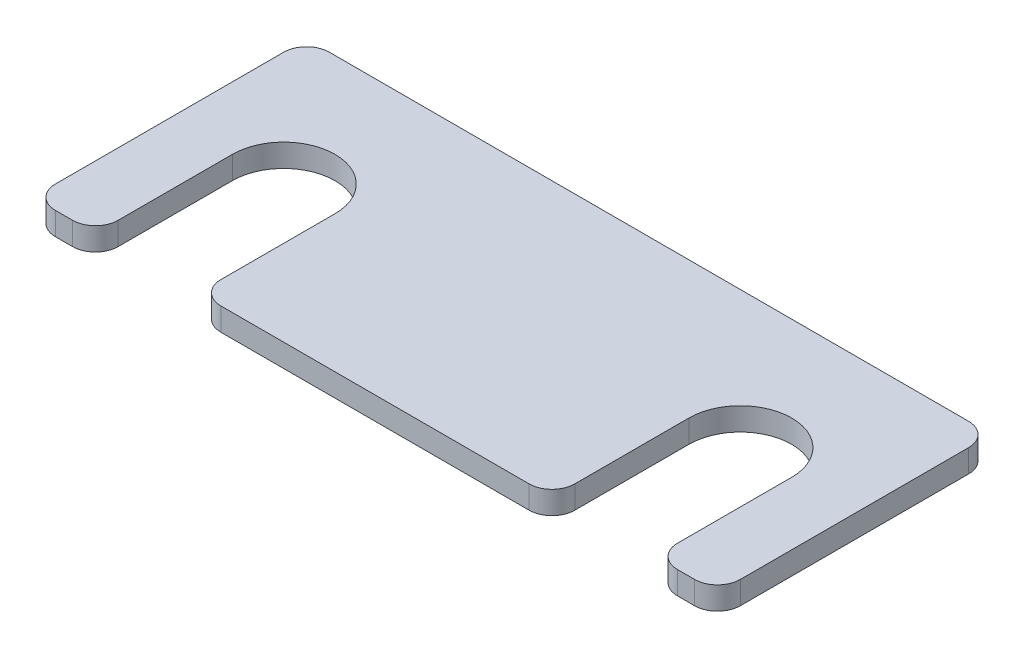
ISO-10303-21;
HEADER;
FILE_DESCRIPTION(('STEP AP214'),'2;1');
FILE_NAME('part.step','',(''),(''),'','','');
FILE_SCHEMA(('AUTOMOTIVE_DESIGN { 1 0 10303 214 1 1 1 1 }'));
ENDSEC;
DATA;
#1=APPLICATION_CONTEXT('core data for automotive mechanical design processes');
#2=APPLICATION_PROTOCOL_DEFINITION('international standard','automotive_design',2000,#1);
#3=PRODUCT_CONTEXT('',#1,'mechanical');
#4=PRODUCT('Part','Part','',(#3));
#5=PRODUCT_RELATED_PRODUCT_CATEGORY('part','',(#4));
#6=PRODUCT_DEFINITION_FORMATION('','',#4);
#7=PRODUCT_DEFINITION_CONTEXT('part definition',#1,'design');
#8=PRODUCT_DEFINITION('design','',#6,#7);
#9=PRODUCT_DEFINITION_SHAPE('','',#8);
#10=(LENGTH_UNIT() NAMED_UNIT(*) SI_UNIT(.MILLI.,.METRE.));
#11=(NAMED_UNIT(*) PLANE_ANGLE_UNIT() SI_UNIT($,.RADIAN.));
#12=(NAMED_UNIT(*) SI_UNIT($,.STERADIAN.) SOLID_ANGLE_UNIT());
#13=UNCERTAINTY_MEASURE_WITH_UNIT(LENGTH_MEASURE(1.E-05),#10,'distance_accuracy_value','');
#14=(GEOMETRIC_REPRESENTATION_CONTEXT(3) GLOBAL_UNCERTAINTY_ASSIGNED_CONTEXT((#13)) GLOBAL_UNIT_ASSIGNED_CONTEXT((#10,
#11,#12)) REPRESENTATION_CONTEXT('',''));
#15=CARTESIAN_POINT('',(0.,0.,0.));
#16=DIRECTION('',(0.,0.,1.));
#17=DIRECTION('',(1.,0.,0.));
#18=AXIS2_PLACEMENT_3D('',#15,#16,#17);
#19=CARTESIAN_POINT('',(14.,-1.,5.));
#20=DIRECTION('',(0.,1.,0.));
#21=DIRECTION('',(0.,0.,1.));
#22=AXIS2_PLACEMENT_3D('',#19,#20,#21);
#23=CYLINDRICAL_SURFACE('',#22,1.);
#24=CARTESIAN_POINT('',(14.,0.,5.));
#25=DIRECTION('',(0.,1.,0.));
#26=DIRECTION('',(0.,0.,-1.));
#27=AXIS2_PLACEMENT_3D('',#24,#25,#26);
#28=CIRCLE('',#27,1.);
#29=CARTESIAN_POINT('',(14.,0.,6.));
#30=VERTEX_POINT('',#29);
#31=CARTESIAN_POINT('',(15.,0.,5.));
#32=VERTEX_POINT('',#31);
#33=EDGE_CURVE('E42',#30,#32,#28,.T.);
#34=ORIENTED_EDGE('',*,*,#33,.F.);
#35=DIRECTION('',(0.,1.,0.));
#36=VECTOR('',#35,1.);
#37=CARTESIAN_POINT('',(14.,-1.,6.));
#38=LINE('',#37,#36);
#39=CARTESIAN_POINT('',(14.,-1.,6.));
#40=VERTEX_POINT('',#39);
#41=EDGE_CURVE('E116',#40,#30,#38,.T.);
#42=ORIENTED_EDGE('',*,*,#41,.F.);
#43=CARTESIAN_POINT('',(14.,-1.,5.));
#44=DIRECTION('',(0.,1.,0.));
#45=DIRECTION('',(0.,0.,-1.));
#46=AXIS2_PLACEMENT_3D('',#43,#44,#45);
#47=CIRCLE('',#46,1.);
#48=CARTESIAN_POINT('',(15.,-1.,5.));
#49=VERTEX_POINT('',#48);
#50=EDGE_CURVE('E11',#40,#49,#47,.T.);
#51=ORIENTED_EDGE('',*,*,#50,.T.);
#52=DIRECTION('',(0.,1.,0.));
#53=VECTOR('',#52,1.);
#54=CARTESIAN_POINT('',(15.,-1.,5.));
#55=LINE('',#54,#53);
#56=EDGE_CURVE('E27',#49,#32,#55,.T.);
#57=ORIENTED_EDGE('',*,*,#56,.T.);
#58=EDGE_LOOP('',(#34,#42,#51,#57));
#59=FACE_BOUND('',#58,.T.);
#60=ADVANCED_FACE('F16',(#59),#23,.T.);
#61=CARTESIAN_POINT('',(13.25,-1.,6.));
#62=DIRECTION('',(0.,0.,1.));
#63=DIRECTION('',(1.,0.,0.));
#64=AXIS2_PLACEMENT_3D('',#61,#62,#63);
#65=PLANE('',#64);
#66=DIRECTION('',(1.,0.,0.));
#67=VECTOR('',#66,1.);
#68=CARTESIAN_POINT('',(13.25,0.,6.));
#69=LINE('',#68,#67);
#70=CARTESIAN_POINT('',(13.25,0.,6.));
#71=VERTEX_POINT('',#70);
#72=EDGE_CURVE('E338',#71,#30,#69,.T.);
#73=ORIENTED_EDGE('',*,*,#72,.F.);
#74=DIRECTION('',(0.,1.,0.));
#75=VECTOR('',#74,1.);
#76=CARTESIAN_POINT('',(13.25,-1.,6.));
#77=LINE('',#76,#75);
#78=CARTESIAN_POINT('',(13.25,-1.,6.));
#79=VERTEX_POINT('',#78);
#80=EDGE_CURVE('E288',#79,#71,#77,.T.);
#81=ORIENTED_EDGE('',*,*,#80,.F.);
#82=DIRECTION('',(1.,0.,0.));
#83=VECTOR('',#82,1.);
#84=CARTESIAN_POINT('',(13.25,-1.,6.));
#85=LINE('',#84,#83);
#86=EDGE_CURVE('E113',#79,#40,#85,.T.);
#87=ORIENTED_EDGE('',*,*,#86,.T.);
#88=ORIENTED_EDGE('',*,*,#41,.T.);
#89=EDGE_LOOP('',(#73,#81,#87,#88));
#90=FACE_BOUND('',#89,.T.);
#91=ADVANCED_FACE('F18',(#90),#65,.T.);
#92=CARTESIAN_POINT('',(13.25,-1.,5.));
#93=DIRECTION('',(0.,1.,0.));
#94=DIRECTION('',(0.,0.,1.));
#95=AXIS2_PLACEMENT_3D('',#92,#93,#94);
#96=CYLINDRICAL_SURFACE('',#95,1.);
#97=CARTESIAN_POINT('',(13.25,0.,5.));
#98=DIRECTION('',(0.,1.,0.));
#99=DIRECTION('',(0.,0.,1.));
#100=AXIS2_PLACEMENT_3D('',#97,#98,#99);
#101=CIRCLE('',#100,1.);
#102=CARTESIAN_POINT('',(12.25,0.,5.));
#103=VERTEX_POINT('',#102);
#104=EDGE_CURVE('E299',#103,#71,#101,.T.);
#105=ORIENTED_EDGE('',*,*,#104,.F.);
#106=DIRECTION('',(0.,1.,0.));
#107=VECTOR('',#106,1.);
#108=CARTESIAN_POINT('',(12.25,-1.,5.));
#109=LINE('',#108,#107);
#110=CARTESIAN_POINT('',(12.25,-1.,5.));
#111=VERTEX_POINT('',#110);
#112=EDGE_CURVE('E252',#111,#103,#109,.T.);
#113=ORIENTED_EDGE('',*,*,#112,.F.);
#114=CARTESIAN_POINT('',(13.25,-1.,5.));
#115=DIRECTION('',(0.,1.,0.));
#116=DIRECTION('',(0.,0.,1.));
#117=AXIS2_PLACEMENT_3D('',#114,#115,#116);
#118=CIRCLE('',#117,1.);
#119=EDGE_CURVE('E184',#111,#79,#118,.T.);
#120=ORIENTED_EDGE('',*,*,#119,.T.);
#121=ORIENTED_EDGE('',*,*,#80,.T.);
#122=EDGE_LOOP('',(#105,#113,#120,#121));
#123=FACE_BOUND('',#122,.T.);
#124=ADVANCED_FACE('F482',(#123),#96,.T.);
#125=CARTESIAN_POINT('',(12.25,-1.,0.));
#126=DIRECTION('',(-1.,0.,0.));
#127=DIRECTION('',(0.,0.,1.));
#128=AXIS2_PLACEMENT_3D('',#125,#126,#127);
#129=PLANE('',#128);
#130=DIRECTION('',(0.,0.,1.));
#131=VECTOR('',#130,1.);
#132=CARTESIAN_POINT('',(12.25,0.,0.));
#133=LINE('',#132,#131);
#134=CARTESIAN_POINT('',(12.25,0.,0.));
#135=VERTEX_POINT('',#134);
#136=EDGE_CURVE('E196',#135,#103,#133,.T.);
#137=ORIENTED_EDGE('',*,*,#136,.F.);
#138=DIRECTION('',(0.,1.,0.));
#139=VECTOR('',#138,1.);
#140=CARTESIAN_POINT('',(12.25,-1.,0.));
#141=LINE('',#140,#139);
#142=CARTESIAN_POINT('',(12.25,-1.,0.));
#143=VERTEX_POINT('',#142);
#144=EDGE_CURVE('E201',#143,#135,#141,.T.);
#145=ORIENTED_EDGE('',*,*,#144,.F.);
#146=DIRECTION('',(0.,0.,1.));
#147=VECTOR('',#146,1.);
#148=CARTESIAN_POINT('',(12.25,-1.,0.));
#149=LINE('',#148,#147);
#150=EDGE_CURVE('E256',#143,#111,#149,.T.);
#151=ORIENTED_EDGE('',*,*,#150,.T.);
#152=ORIENTED_EDGE('',*,*,#112,.T.);
#153=EDGE_LOOP('',(#137,#145,#151,#152));
#154=FACE_BOUND('',#153,.T.);
#155=ADVANCED_FACE('F501',(#154),#129,.T.);
#156=CARTESIAN_POINT('',(10.,-1.,0.));
#157=DIRECTION('',(0.,1.,0.));
#158=DIRECTION('',(0.,0.,1.));
#159=AXIS2_PLACEMENT_3D('',#156,#157,#158);
#160=CYLINDRICAL_SURFACE('',#159,2.25);
#161=CARTESIAN_POINT('',(10.,0.,0.));
#162=DIRECTION('',(0.,-1.,0.));
#163=DIRECTION('',(0.,0.,1.));
#164=AXIS2_PLACEMENT_3D('',#161,#162,#163);
#165=CIRCLE('',#164,2.25);
#166=CARTESIAN_POINT('',(7.75,0.,0.));
#167=VERTEX_POINT('',#166);
#168=EDGE_CURVE('E191',#167,#135,#165,.T.);
#169=ORIENTED_EDGE('',*,*,#168,.F.);
#170=DIRECTION('',(0.,1.,0.));
#171=VECTOR('',#170,1.);
#172=CARTESIAN_POINT('',(7.75,-1.,0.));
#173=LINE('',#172,#171);
#174=CARTESIAN_POINT('',(7.75,-1.,0.));
#175=VERTEX_POINT('',#174);
#176=EDGE_CURVE('E202',#175,#167,#173,.T.);
#177=ORIENTED_EDGE('',*,*,#176,.F.);
#178=CARTESIAN_POINT('',(10.,-1.,0.));
#179=DIRECTION('',(0.,-1.,0.));
#180=DIRECTION('',(0.,0.,1.));
#181=AXIS2_PLACEMENT_3D('',#178,#179,#180);
#182=CIRCLE('',#181,2.25);
#183=EDGE_CURVE('E257',#175,#143,#182,.T.);
#184=ORIENTED_EDGE('',*,*,#183,.T.);
#185=ORIENTED_EDGE('',*,*,#144,.T.);
#186=EDGE_LOOP('',(#169,#177,#184,#185));
#187=FACE_BOUND('',#186,.T.);
#188=ADVANCED_FACE('F485',(#187),#160,.F.);
#189=CARTESIAN_POINT('',(7.75,-1.,0.));
#190=DIRECTION('',(1.,0.,0.));
#191=DIRECTION('',(0.,1.,0.));
#192=AXIS2_PLACEMENT_3D('',#189,#190,#191);
#193=PLANE('',#192);
#194=DIRECTION('',(0.,0.,-1.));
#195=VECTOR('',#194,1.);
#196=CARTESIAN_POINT('',(7.75,0.,0.));
#197=LINE('',#196,#195);
#198=CARTESIAN_POINT('',(7.75,0.,5.));
#199=VERTEX_POINT('',#198);
#200=EDGE_CURVE('E195',#199,#167,#197,.T.);
#201=ORIENTED_EDGE('',*,*,#200,.F.);
#202=DIRECTION('',(0.,1.,0.));
#203=VECTOR('',#202,1.);
#204=CARTESIAN_POINT('',(7.75,-1.,5.));
#205=LINE('',#204,#203);
#206=CARTESIAN_POINT('',(7.75,-1.,5.));
#207=VERTEX_POINT('',#206);
#208=EDGE_CURVE('E188',#207,#199,#205,.T.);
#209=ORIENTED_EDGE('',*,*,#208,.F.);
#210=DIRECTION('',(0.,0.,-1.));
#211=VECTOR('',#210,1.);
#212=CARTESIAN_POINT('',(7.75,-1.,0.));
#213=LINE('',#212,#211);
#214=EDGE_CURVE('E197',#207,#175,#213,.T.);
#215=ORIENTED_EDGE('',*,*,#214,.T.);
#216=ORIENTED_EDGE('',*,*,#176,.T.);
#217=EDGE_LOOP('',(#201,#209,#215,#216));
#218=FACE_BOUND('',#217,.T.);
#219=ADVANCED_FACE('F489',(#218),#193,.T.);
#220=CARTESIAN_POINT('',(6.75,-1.,5.));
#221=DIRECTION('',(0.,1.,0.));
#222=DIRECTION('',(0.,0.,1.));
#223=AXIS2_PLACEMENT_3D('',#220,#221,#222);
#224=CYLINDRICAL_SURFACE('',#223,1.);
#225=CARTESIAN_POINT('',(6.75,0.,5.));
#226=DIRECTION('',(0.,1.,0.));
#227=DIRECTION('',(0.,0.,-1.));
#228=AXIS2_PLACEMENT_3D('',#225,#226,#227);
#229=CIRCLE('',#228,1.);
#230=CARTESIAN_POINT('',(6.75,0.,6.));
#231=VERTEX_POINT('',#230);
#232=EDGE_CURVE('E239',#231,#199,#229,.T.);
#233=ORIENTED_EDGE('',*,*,#232,.F.);
#234=DIRECTION('',(0.,1.,0.));
#235=VECTOR('',#234,1.);
#236=CARTESIAN_POINT('',(6.75,-1.,6.));
#237=LINE('',#236,#235);
#238=CARTESIAN_POINT('',(6.75,-1.,6.));
#239=VERTEX_POINT('',#238);
#240=EDGE_CURVE('E189',#239,#231,#237,.T.);
#241=ORIENTED_EDGE('',*,*,#240,.F.);
#242=CARTESIAN_POINT('',(6.75,-1.,5.));
#243=DIRECTION('',(0.,1.,0.));
#244=DIRECTION('',(0.,0.,-1.));
#245=AXIS2_PLACEMENT_3D('',#242,#243,#244);
#246=CIRCLE('',#245,1.);
#247=EDGE_CURVE('E284',#239,#207,#246,.T.);
#248=ORIENTED_EDGE('',*,*,#247,.T.);
#249=ORIENTED_EDGE('',*,*,#208,.T.);
#250=EDGE_LOOP('',(#233,#241,#248,#249));
#251=FACE_BOUND('',#250,.T.);
#252=ADVANCED_FACE('F491',(#251),#224,.T.);
#253=CARTESIAN_POINT('',(-6.75,-1.,6.));
#254=DIRECTION('',(0.,0.,1.));
#255=DIRECTION('',(1.,0.,0.));
#256=AXIS2_PLACEMENT_3D('',#253,#254,#255);
#257=PLANE('',#256);
#258=DIRECTION('',(1.,0.,0.));
#259=VECTOR('',#258,1.);
#260=CARTESIAN_POINT('',(-6.75,0.,6.));
#261=LINE('',#260,#259);
#262=CARTESIAN_POINT('',(-6.75,0.,6.));
#263=VERTEX_POINT('',#262);
#264=EDGE_CURVE('E138',#263,#231,#261,.T.);
#265=ORIENTED_EDGE('',*,*,#264,.F.);
#266=DIRECTION('',(0.,1.,0.));
#267=VECTOR('',#266,1.);
#268=CARTESIAN_POINT('',(-6.75,-1.,6.));
#269=LINE('',#268,#267);
#270=CARTESIAN_POINT('',(-6.75,-1.,6.));
#271=VERTEX_POINT('',#270);
#272=EDGE_CURVE('E154',#271,#263,#269,.T.);
#273=ORIENTED_EDGE('',*,*,#272,.F.);
#274=DIRECTION('',(1.,0.,0.));
#275=VECTOR('',#274,1.);
#276=CARTESIAN_POINT('',(-6.75,-1.,6.));
#277=LINE('',#276,#275);
#278=EDGE_CURVE('E185',#271,#239,#277,.T.);
#279=ORIENTED_EDGE('',*,*,#278,.T.);
#280=ORIENTED_EDGE('',*,*,#240,.T.);
#281=EDGE_LOOP('',(#265,#273,#279,#280));
#282=FACE_BOUND('',#281,.T.);
#283=ADVANCED_FACE('F512',(#282),#257,.T.);
#284=CARTESIAN_POINT('',(-6.75,-1.,5.));
#285=DIRECTION('',(0.,1.,0.));
#286=DIRECTION('',(0.,0.,1.));
#287=AXIS2_PLACEMENT_3D('',#284,#285,#286);
#288=CYLINDRICAL_SURFACE('',#287,1.);
#289=CARTESIAN_POINT('',(-6.75,0.,5.));
#290=DIRECTION('',(0.,1.,0.));
#291=DIRECTION('',(0.,0.,1.));
#292=AXIS2_PLACEMENT_3D('',#289,#290,#291);
#293=CIRCLE('',#292,1.);
#294=CARTESIAN_POINT('',(-7.75,0.,5.));
#295=VERTEX_POINT('',#294);
#296=EDGE_CURVE('E295',#295,#263,#293,.T.);
#297=ORIENTED_EDGE('',*,*,#296,.F.);
#298=DIRECTION('',(0.,1.,0.));
#299=VECTOR('',#298,1.);
#300=CARTESIAN_POINT('',(-7.75,-1.,5.));
#301=LINE('',#300,#299);
#302=CARTESIAN_POINT('',(-7.75,-1.,5.));
#303=VERTEX_POINT('',#302);
#304=EDGE_CURVE('E140',#303,#295,#301,.T.);
#305=ORIENTED_EDGE('',*,*,#304,.F.);
#306=CARTESIAN_POINT('',(-6.75,-1.,5.));
#307=DIRECTION('',(0.,1.,0.));
#308=DIRECTION('',(0.,0.,1.));
#309=AXIS2_PLACEMENT_3D('',#306,#307,#308);
#310=CIRCLE('',#309,1.);
#311=EDGE_CURVE('E267',#303,#271,#310,.T.);
#312=ORIENTED_EDGE('',*,*,#311,.T.);
#313=ORIENTED_EDGE('',*,*,#272,.T.);
#314=EDGE_LOOP('',(#297,#305,#312,#313));
#315=FACE_BOUND('',#314,.T.);
#316=ADVANCED_FACE('F516',(#315),#288,.T.);
#317=CARTESIAN_POINT('',(-7.75,-1.,0.));
#318=DIRECTION('',(-1.,0.,0.));
#319=DIRECTION('',(0.,0.,1.));
#320=AXIS2_PLACEMENT_3D('',#317,#318,#319);
#321=PLANE('',#320);
#322=DIRECTION('',(0.,0.,1.));
#323=VECTOR('',#322,1.);
#324=CARTESIAN_POINT('',(-7.75,0.,0.));
#325=LINE('',#324,#323);
#326=CARTESIAN_POINT('',(-7.75,0.,0.));
#327=VERTEX_POINT('',#326);
#328=EDGE_CURVE('E292',#327,#295,#325,.T.);
#329=ORIENTED_EDGE('',*,*,#328,.F.);
#330=DIRECTION('',(0.,1.,0.));
#331=VECTOR('',#330,1.);
#332=CARTESIAN_POINT('',(-7.75,-1.,0.));
#333=LINE('',#332,#331);
#334=CARTESIAN_POINT('',(-7.75,-1.,0.));
#335=VERTEX_POINT('',#334);
#336=EDGE_CURVE('E157',#335,#327,#333,.T.);
#337=ORIENTED_EDGE('',*,*,#336,.F.);
#338=DIRECTION('',(0.,0.,1.));
#339=VECTOR('',#338,1.);
#340=CARTESIAN_POINT('',(-7.75,-1.,0.));
#341=LINE('',#340,#339);
#342=EDGE_CURVE('E143',#335,#303,#341,.T.);
#343=ORIENTED_EDGE('',*,*,#342,.T.);
#344=ORIENTED_EDGE('',*,*,#304,.T.);
#345=EDGE_LOOP('',(#329,#337,#343,#344));
#346=FACE_BOUND('',#345,.T.);
#347=ADVANCED_FACE('F509',(#346),#321,.T.);
#348=CARTESIAN_POINT('',(-10.,-1.,0.));
#349=DIRECTION('',(0.,1.,0.));
#350=DIRECTION('',(0.,0.,1.));
#351=AXIS2_PLACEMENT_3D('',#348,#349,#350);
#352=CYLINDRICAL_SURFACE('',#351,2.25);
#353=CARTESIAN_POINT('',(-10.,0.,0.));
#354=DIRECTION('',(0.,-1.,0.));
#355=DIRECTION('',(0.,0.,1.));
#356=AXIS2_PLACEMENT_3D('',#353,#354,#355);
#357=CIRCLE('',#356,2.25);
#358=CARTESIAN_POINT('',(-12.25,0.,0.));
#359=VERTEX_POINT('',#358);
#360=EDGE_CURVE('E245',#359,#327,#357,.T.);
#361=ORIENTED_EDGE('',*,*,#360,.F.);
#362=DIRECTION('',(0.,1.,0.));
#363=VECTOR('',#362,1.);
#364=CARTESIAN_POINT('',(-12.25,-1.,0.));
#365=LINE('',#364,#363);
#366=CARTESIAN_POINT('',(-12.25,-1.,0.));
#367=VERTEX_POINT('',#366);
#368=EDGE_CURVE('E173',#367,#359,#365,.T.);
#369=ORIENTED_EDGE('',*,*,#368,.F.);
#370=CARTESIAN_POINT('',(-10.,-1.,0.));
#371=DIRECTION('',(0.,-1.,0.));
#372=DIRECTION('',(0.,0.,1.));
#373=AXIS2_PLACEMENT_3D('',#370,#371,#372);
#374=CIRCLE('',#373,2.25);
#375=EDGE_CURVE('E20',#367,#335,#374,.T.);
#376=ORIENTED_EDGE('',*,*,#375,.T.);
#377=ORIENTED_EDGE('',*,*,#336,.T.);
#378=EDGE_LOOP('',(#361,#369,#376,#377));
#379=FACE_BOUND('',#378,.T.);
#380=ADVANCED_FACE('F488',(#379),#352,.F.);
#381=CARTESIAN_POINT('',(-12.25,-1.,0.));
#382=DIRECTION('',(1.,0.,0.));
#383=DIRECTION('',(0.,1.,0.));
#384=AXIS2_PLACEMENT_3D('',#381,#382,#383);
#385=PLANE('',#384);
#386=DIRECTION('',(0.,0.,-1.));
#387=VECTOR('',#386,1.);
#388=CARTESIAN_POINT('',(-12.25,0.,0.));
#389=LINE('',#388,#387);
#390=CARTESIAN_POINT('',(-12.25,0.,5.));
#391=VERTEX_POINT('',#390);
#392=EDGE_CURVE('E240',#391,#359,#389,.T.);
#393=ORIENTED_EDGE('',*,*,#392,.F.);
#394=DIRECTION('',(0.,1.,0.));
#395=VECTOR('',#394,1.);
#396=CARTESIAN_POINT('',(-12.25,-1.,5.));
#397=LINE('',#396,#395);
#398=CARTESIAN_POINT('',(-12.25,-1.,5.));
#399=VERTEX_POINT('',#398);
#400=EDGE_CURVE('E181',#399,#391,#397,.T.);
#401=ORIENTED_EDGE('',*,*,#400,.F.);
#402=DIRECTION('',(0.,0.,-1.));
#403=VECTOR('',#402,1.);
#404=CARTESIAN_POINT('',(-12.25,-1.,0.));
#405=LINE('',#404,#403);
#406=EDGE_CURVE('E165',#399,#367,#405,.T.);
#407=ORIENTED_EDGE('',*,*,#406,.T.);
#408=ORIENTED_EDGE('',*,*,#368,.T.);
#409=EDGE_LOOP('',(#393,#401,#407,#408));
#410=FACE_BOUND('',#409,.T.);
#411=ADVANCED_FACE('F473',(#410),#385,.T.);
#412=CARTESIAN_POINT('',(-13.25,-1.,5.));
#413=DIRECTION('',(0.,1.,0.));
#414=DIRECTION('',(0.,0.,1.));
#415=AXIS2_PLACEMENT_3D('',#412,#413,#414);
#416=CYLINDRICAL_SURFACE('',#415,1.);
#417=CARTESIAN_POINT('',(-13.25,0.,5.));
#418=DIRECTION('',(0.,1.,0.));
#419=DIRECTION('',(0.,0.,-1.));
#420=AXIS2_PLACEMENT_3D('',#417,#418,#419);
#421=CIRCLE('',#420,1.);
#422=CARTESIAN_POINT('',(-13.25,0.,6.));
#423=VERTEX_POINT('',#422);
#424=EDGE_CURVE('E244',#423,#391,#421,.T.);
#425=ORIENTED_EDGE('',*,*,#424,.F.);
#426=DIRECTION('',(0.,1.,0.));
#427=VECTOR('',#426,1.);
#428=CARTESIAN_POINT('',(-13.25,-1.,6.));
#429=LINE('',#428,#427);
#430=CARTESIAN_POINT('',(-13.25,-1.,6.));
#431=VERTEX_POINT('',#430);
#432=EDGE_CURVE('E275',#431,#423,#429,.T.);
#433=ORIENTED_EDGE('',*,*,#432,.F.);
#434=CARTESIAN_POINT('',(-13.25,-1.,5.));
#435=DIRECTION('',(0.,1.,0.));
#436=DIRECTION('',(0.,0.,-1.));
#437=AXIS2_PLACEMENT_3D('',#434,#435,#436);
#438=CIRCLE('',#437,1.);
#439=EDGE_CURVE('E177',#431,#399,#438,.T.);
#440=ORIENTED_EDGE('',*,*,#439,.T.);
#441=ORIENTED_EDGE('',*,*,#400,.T.);
#442=EDGE_LOOP('',(#425,#433,#440,#441));
#443=FACE_BOUND('',#442,.T.);
#444=ADVANCED_FACE('F462',(#443),#416,.T.);
#445=CARTESIAN_POINT('',(-14.,-1.,6.));
#446=DIRECTION('',(0.,0.,1.));
#447=DIRECTION('',(1.,0.,0.));
#448=AXIS2_PLACEMENT_3D('',#445,#446,#447);
#449=PLANE('',#448);
#450=DIRECTION('',(1.,0.,0.));
#451=VECTOR('',#450,1.);
#452=CARTESIAN_POINT('',(-14.,0.,6.));
#453=LINE('',#452,#451);
#454=CARTESIAN_POINT('',(-14.,0.,6.));
#455=VERTEX_POINT('',#454);
#456=EDGE_CURVE('E274',#455,#423,#453,.T.);
#457=ORIENTED_EDGE('',*,*,#456,.F.);
#458=DIRECTION('',(0.,1.,0.));
#459=VECTOR('',#458,1.);
#460=CARTESIAN_POINT('',(-14.,-1.,6.));
#461=LINE('',#460,#459);
#462=CARTESIAN_POINT('',(-14.,-1.,6.));
#463=VERTEX_POINT('',#462);
#464=EDGE_CURVE('E231',#463,#455,#461,.T.);
#465=ORIENTED_EDGE('',*,*,#464,.F.);
#466=DIRECTION('',(1.,0.,0.));
#467=VECTOR('',#466,1.);
#468=CARTESIAN_POINT('',(-14.,-1.,6.));
#469=LINE('',#468,#467);
#470=EDGE_CURVE('E279',#463,#431,#469,.T.);
#471=ORIENTED_EDGE('',*,*,#470,.T.);
#472=ORIENTED_EDGE('',*,*,#432,.T.);
#473=EDGE_LOOP('',(#457,#465,#471,#472));
#474=FACE_BOUND('',#473,.T.);
#475=ADVANCED_FACE('F464',(#474),#449,.T.);
#476=CARTESIAN_POINT('',(-14.,-1.,5.));
#477=DIRECTION('',(0.,1.,0.));
#478=DIRECTION('',(0.,0.,1.));
#479=AXIS2_PLACEMENT_3D('',#476,#477,#478);
#480=CYLINDRICAL_SURFACE('',#479,1.);
#481=CARTESIAN_POINT('',(-14.,0.,5.));
#482=DIRECTION('',(0.,1.,0.));
#483=DIRECTION('',(0.,0.,1.));
#484=AXIS2_PLACEMENT_3D('',#481,#482,#483);
#485=CIRCLE('',#484,1.);
#486=CARTESIAN_POINT('',(-15.,0.,5.));
#487=VERTEX_POINT('',#486);
#488=EDGE_CURVE('E208',#487,#455,#485,.T.);
#489=ORIENTED_EDGE('',*,*,#488,.F.);
#490=DIRECTION('',(0.,1.,0.));
#491=VECTOR('',#490,1.);
#492=CARTESIAN_POINT('',(-15.,-1.,5.));
#493=LINE('',#492,#491);
#494=CARTESIAN_POINT('',(-15.,-1.,5.));
#495=VERTEX_POINT('',#494);
#496=EDGE_CURVE('E250',#495,#487,#493,.T.);
#497=ORIENTED_EDGE('',*,*,#496,.F.);
#498=CARTESIAN_POINT('',(-14.,-1.,5.));
#499=DIRECTION('',(0.,1.,0.));
#500=DIRECTION('',(0.,0.,1.));
#501=AXIS2_PLACEMENT_3D('',#498,#499,#500);
#502=CIRCLE('',#501,1.);
#503=EDGE_CURVE('E280',#495,#463,#502,.T.);
#504=ORIENTED_EDGE('',*,*,#503,.T.);
#505=ORIENTED_EDGE('',*,*,#464,.T.);
#506=EDGE_LOOP('',(#489,#497,#504,#505));
#507=FACE_BOUND('',#506,.T.);
#508=ADVANCED_FACE('F394',(#507),#480,.T.);
#509=CARTESIAN_POINT('',(-15.,-1.,-5.));
#510=DIRECTION('',(-1.,0.,0.));
#511=DIRECTION('',(0.,1.,0.));
#512=AXIS2_PLACEMENT_3D('',#509,#510,#511);
#513=PLANE('',#512);
#514=DIRECTION('',(0.,0.,1.));
#515=VECTOR('',#514,1.);
#516=CARTESIAN_POINT('',(-15.,0.,-5.));
#517=LINE('',#516,#515);
#518=CARTESIAN_POINT('',(-15.,0.,-5.));
#519=VERTEX_POINT('',#518);
#520=EDGE_CURVE('E203',#519,#487,#517,.T.);
#521=ORIENTED_EDGE('',*,*,#520,.F.);
#522=DIRECTION('',(0.,1.,0.));
#523=VECTOR('',#522,1.);
#524=CARTESIAN_POINT('',(-15.,-1.,-5.));
#525=LINE('',#524,#523);
#526=CARTESIAN_POINT('',(-15.,-1.,-5.));
#527=VERTEX_POINT('',#526);
#528=EDGE_CURVE('E251',#527,#519,#525,.T.);
#529=ORIENTED_EDGE('',*,*,#528,.F.);
#530=DIRECTION('',(0.,0.,1.));
#531=VECTOR('',#530,1.);
#532=CARTESIAN_POINT('',(-15.,-1.,-5.));
#533=LINE('',#532,#531);
#534=EDGE_CURVE('E258',#527,#495,#533,.T.);
#535=ORIENTED_EDGE('',*,*,#534,.T.);
#536=ORIENTED_EDGE('',*,*,#496,.T.);
#537=EDGE_LOOP('',(#521,#529,#535,#536));
#538=FACE_BOUND('',#537,.T.);
#539=ADVANCED_FACE('F382',(#538),#513,.T.);
#540=CARTESIAN_POINT('',(-14.,-1.,-5.));
#541=DIRECTION('',(0.,1.,0.));
#542=DIRECTION('',(0.,0.,1.));
#543=AXIS2_PLACEMENT_3D('',#540,#541,#542);
#544=CYLINDRICAL_SURFACE('',#543,1.);
#545=CARTESIAN_POINT('',(-14.,0.,-5.));
#546=DIRECTION('',(0.,1.,0.));
#547=DIRECTION('',(0.,0.,-1.));
#548=AXIS2_PLACEMENT_3D('',#545,#546,#547);
#549=CIRCLE('',#548,1.);
#550=CARTESIAN_POINT('',(-14.,0.,-6.));
#551=VERTEX_POINT('',#550);
#552=EDGE_CURVE('E207',#551,#519,#549,.T.);
#553=ORIENTED_EDGE('',*,*,#552,.F.);
#554=DIRECTION('',(0.,1.,0.));
#555=VECTOR('',#554,1.);
#556=CARTESIAN_POINT('',(-14.,-1.,-6.));
#557=LINE('',#556,#555);
#558=CARTESIAN_POINT('',(-14.,-1.,-6.));
#559=VERTEX_POINT('',#558);
#560=EDGE_CURVE('E210',#559,#551,#557,.T.);
#561=ORIENTED_EDGE('',*,*,#560,.F.);
#562=CARTESIAN_POINT('',(-14.,-1.,-5.));
#563=DIRECTION('',(0.,1.,0.));
#564=DIRECTION('',(0.,0.,-1.));
#565=AXIS2_PLACEMENT_3D('',#562,#563,#564);
#566=CIRCLE('',#565,1.);
#567=EDGE_CURVE('E246',#559,#527,#566,.T.);
#568=ORIENTED_EDGE('',*,*,#567,.T.);
#569=ORIENTED_EDGE('',*,*,#528,.T.);
#570=EDGE_LOOP('',(#553,#561,#568,#569));
#571=FACE_BOUND('',#570,.T.);
#572=ADVANCED_FACE('F378',(#571),#544,.T.);
#573=CARTESIAN_POINT('',(-14.,-1.,-6.));
#574=DIRECTION('',(0.,0.,-1.));
#575=DIRECTION('',(0.,-1.,0.));
#576=AXIS2_PLACEMENT_3D('',#573,#574,#575);
#577=PLANE('',#576);
#578=DIRECTION('',(-1.,0.,0.));
#579=VECTOR('',#578,1.);
#580=CARTESIAN_POINT('',(-14.,0.,-6.));
#581=LINE('',#580,#579);
#582=CARTESIAN_POINT('',(14.,0.,-6.));
#583=VERTEX_POINT('',#582);
#584=EDGE_CURVE('E221',#583,#551,#581,.T.);
#585=ORIENTED_EDGE('',*,*,#584,.F.);
#586=DIRECTION('',(0.,1.,0.));
#587=VECTOR('',#586,1.);
#588=CARTESIAN_POINT('',(14.,-1.,-6.));
#589=LINE('',#588,#587);
#590=CARTESIAN_POINT('',(14.,-1.,-6.));
#591=VERTEX_POINT('',#590);
#592=EDGE_CURVE('E126',#591,#583,#589,.T.);
#593=ORIENTED_EDGE('',*,*,#592,.F.);
#594=DIRECTION('',(-1.,0.,0.));
#595=VECTOR('',#594,1.);
#596=CARTESIAN_POINT('',(-14.,-1.,-6.));
#597=LINE('',#596,#595);
#598=EDGE_CURVE('E306',#591,#559,#597,.T.);
#599=ORIENTED_EDGE('',*,*,#598,.T.);
#600=ORIENTED_EDGE('',*,*,#560,.T.);
#601=EDGE_LOOP('',(#585,#593,#599,#600));
#602=FACE_BOUND('',#601,.T.);
#603=ADVANCED_FACE('F369',(#602),#577,.T.);
#604=CARTESIAN_POINT('',(14.,-1.,-5.));
#605=DIRECTION('',(0.,1.,0.));
#606=DIRECTION('',(0.,0.,1.));
#607=AXIS2_PLACEMENT_3D('',#604,#605,#606);
#608=CYLINDRICAL_SURFACE('',#607,1.);
#609=CARTESIAN_POINT('',(14.,0.,-5.));
#610=DIRECTION('',(0.,1.,0.));
#611=DIRECTION('',(0.,0.,1.));
#612=AXIS2_PLACEMENT_3D('',#609,#610,#611);
#613=CIRCLE('',#612,1.);
#614=CARTESIAN_POINT('',(15.,0.,-5.));
#615=VERTEX_POINT('',#614);
#616=EDGE_CURVE('E212',#615,#583,#613,.T.);
#617=ORIENTED_EDGE('',*,*,#616,.F.);
#618=DIRECTION('',(0.,1.,0.));
#619=VECTOR('',#618,1.);
#620=CARTESIAN_POINT('',(15.,-1.,-5.));
#621=LINE('',#620,#619);
#622=CARTESIAN_POINT('',(15.,-1.,-5.));
#623=VERTEX_POINT('',#622);
#624=EDGE_CURVE('E127',#623,#615,#621,.T.);
#625=ORIENTED_EDGE('',*,*,#624,.F.);
#626=CARTESIAN_POINT('',(14.,-1.,-5.));
#627=DIRECTION('',(0.,1.,0.));
#628=DIRECTION('',(0.,0.,1.));
#629=AXIS2_PLACEMENT_3D('',#626,#627,#628);
#630=CIRCLE('',#629,1.);
#631=EDGE_CURVE('E124',#623,#591,#630,.T.);
#632=ORIENTED_EDGE('',*,*,#631,.T.);
#633=ORIENTED_EDGE('',*,*,#592,.T.);
#634=EDGE_LOOP('',(#617,#625,#632,#633));
#635=FACE_BOUND('',#634,.T.);
#636=ADVANCED_FACE('F495',(#635),#608,.T.);
#637=CARTESIAN_POINT('',(15.,-1.,-5.));
#638=DIRECTION('',(1.,0.,0.));
#639=DIRECTION('',(0.,0.,-1.));
#640=AXIS2_PLACEMENT_3D('',#637,#638,#639);
#641=PLANE('',#640);
#642=DIRECTION('',(0.,0.,-1.));
#643=VECTOR('',#642,1.);
#644=CARTESIAN_POINT('',(15.,0.,-5.));
#645=LINE('',#644,#643);
#646=EDGE_CURVE('E111',#32,#615,#645,.T.);
#647=ORIENTED_EDGE('',*,*,#646,.F.);
#648=ORIENTED_EDGE('',*,*,#56,.F.);
#649=DIRECTION('',(0.,0.,-1.));
#650=VECTOR('',#649,1.);
#651=CARTESIAN_POINT('',(15.,-1.,-5.));
#652=LINE('',#651,#650);
#653=EDGE_CURVE('E109',#49,#623,#652,.T.);
#654=ORIENTED_EDGE('',*,*,#653,.T.);
#655=ORIENTED_EDGE('',*,*,#624,.T.);
#656=EDGE_LOOP('',(#647,#648,#654,#655));
#657=FACE_BOUND('',#656,.T.);
#658=ADVANCED_FACE('F105',(#657),#641,.T.);
#659=CARTESIAN_POINT('',(14.,-1.,5.));
#660=DIRECTION('',(0.,-1.,0.));
#661=DIRECTION('',(0.,0.,-1.));
#662=AXIS2_PLACEMENT_3D('',#659,#660,#661);
#663=PLANE('',#662);
#664=ORIENTED_EDGE('',*,*,#50,.F.);
#665=ORIENTED_EDGE('',*,*,#86,.F.);
#666=ORIENTED_EDGE('',*,*,#119,.F.);
#667=ORIENTED_EDGE('',*,*,#150,.F.);
#668=ORIENTED_EDGE('',*,*,#183,.F.);
#669=ORIENTED_EDGE('',*,*,#214,.F.);
#670=ORIENTED_EDGE('',*,*,#247,.F.);
#671=ORIENTED_EDGE('',*,*,#278,.F.);
#672=ORIENTED_EDGE('',*,*,#311,.F.);
#673=ORIENTED_EDGE('',*,*,#342,.F.);
#674=ORIENTED_EDGE('',*,*,#375,.F.);
#675=ORIENTED_EDGE('',*,*,#406,.F.);
#676=ORIENTED_EDGE('',*,*,#439,.F.);
#677=ORIENTED_EDGE('',*,*,#470,.F.);
#678=ORIENTED_EDGE('',*,*,#503,.F.);
#679=ORIENTED_EDGE('',*,*,#534,.F.);
#680=ORIENTED_EDGE('',*,*,#567,.F.);
#681=ORIENTED_EDGE('',*,*,#598,.F.);
#682=ORIENTED_EDGE('',*,*,#631,.F.);
#683=ORIENTED_EDGE('',*,*,#653,.F.);
#684=EDGE_LOOP('',(#664,#665,#666,#667,#668,#669,#670,#671,#672,#673,#674,#675,#676,#677,#678,
#679,#680,#681,#682,#683));
#685=FACE_BOUND('',#684,.T.);
#686=ADVANCED_FACE('F121',(#685),#663,.T.);
#687=CARTESIAN_POINT('',(14.,0.,5.));
#688=DIRECTION('',(0.,-1.,0.));
#689=DIRECTION('',(0.,0.,-1.));
#690=AXIS2_PLACEMENT_3D('',#687,#688,#689);
#691=PLANE('',#690);
#692=ORIENTED_EDGE('',*,*,#33,.T.);
#693=ORIENTED_EDGE('',*,*,#646,.T.);
#694=ORIENTED_EDGE('',*,*,#616,.T.);
#695=ORIENTED_EDGE('',*,*,#584,.T.);
#696=ORIENTED_EDGE('',*,*,#552,.T.);
#697=ORIENTED_EDGE('',*,*,#520,.T.);
#698=ORIENTED_EDGE('',*,*,#488,.T.);
#699=ORIENTED_EDGE('',*,*,#456,.T.);
#700=ORIENTED_EDGE('',*,*,#424,.T.);
#701=ORIENTED_EDGE('',*,*,#392,.T.);
#702=ORIENTED_EDGE('',*,*,#360,.T.);
#703=ORIENTED_EDGE('',*,*,#328,.T.);
#704=ORIENTED_EDGE('',*,*,#296,.T.);
#705=ORIENTED_EDGE('',*,*,#264,.T.);
#706=ORIENTED_EDGE('',*,*,#232,.T.);
#707=ORIENTED_EDGE('',*,*,#200,.T.);
#708=ORIENTED_EDGE('',*,*,#168,.T.);
#709=ORIENTED_EDGE('',*,*,#136,.T.);
#710=ORIENTED_EDGE('',*,*,#104,.T.);
#711=ORIENTED_EDGE('',*,*,#72,.T.);
#712=EDGE_LOOP('',(#692,#693,#694,#695,#696,#697,#698,#699,#700,#701,#702,#703,#704,#705,#706,
#707,#708,#709,#710,#711));
#713=FACE_BOUND('',#712,.T.);
#714=ADVANCED_FACE('F376',(#713),#691,.F.);
#715=CLOSED_SHELL('',(#60,#91,#124,#155,#188,#219,#252,#283,#316,#347,#380,#411,#444,#475,#508,
#539,#572,#603,#636,#658,#686,#714));
#716=MANIFOLD_SOLID_BREP('B1',#715);
#717=ADVANCED_BREP_SHAPE_REPRESENTATION('',(#18,#716),#14);
#718=SHAPE_DEFINITION_REPRESENTATION(#9,#717);
ENDSEC;
END-ISO-10303-21;
